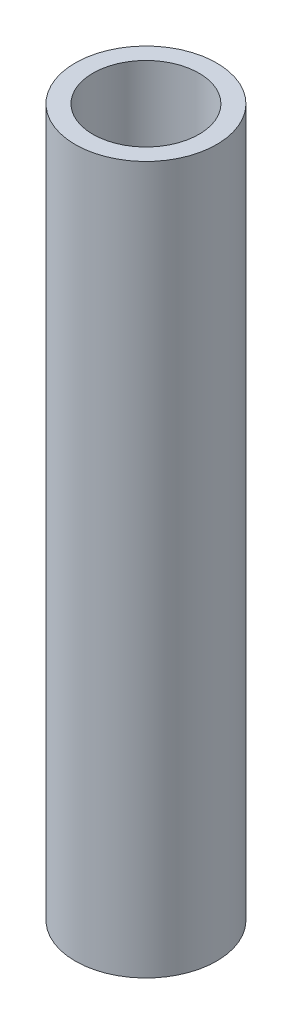
ISO-10303-21;
HEADER;
FILE_DESCRIPTION(('STEP AP214'),'2;1');
FILE_NAME('part.step','',(''),(''),'','','');
FILE_SCHEMA(('AUTOMOTIVE_DESIGN { 1 0 10303 214 1 1 1 1 }'));
ENDSEC;
DATA;
#1=APPLICATION_CONTEXT('core data for automotive mechanical design processes');
#2=APPLICATION_PROTOCOL_DEFINITION('international standard','automotive_design',2000,#1);
#3=PRODUCT_CONTEXT('',#1,'mechanical');
#4=PRODUCT('Part','Part','',(#3));
#5=PRODUCT_RELATED_PRODUCT_CATEGORY('part','',(#4));
#6=PRODUCT_DEFINITION_FORMATION('','',#4);
#7=PRODUCT_DEFINITION_CONTEXT('part definition',#1,'design');
#8=PRODUCT_DEFINITION('design','',#6,#7);
#9=PRODUCT_DEFINITION_SHAPE('','',#8);
#10=(LENGTH_UNIT() NAMED_UNIT(*) SI_UNIT(.MILLI.,.METRE.));
#11=(NAMED_UNIT(*) PLANE_ANGLE_UNIT() SI_UNIT($,.RADIAN.));
#12=(NAMED_UNIT(*) SI_UNIT($,.STERADIAN.) SOLID_ANGLE_UNIT());
#13=UNCERTAINTY_MEASURE_WITH_UNIT(LENGTH_MEASURE(1.E-05),#10,'distance_accuracy_value','');
#14=(GEOMETRIC_REPRESENTATION_CONTEXT(3) GLOBAL_UNCERTAINTY_ASSIGNED_CONTEXT((#13)) GLOBAL_UNIT_ASSIGNED_CONTEXT((#10,
#11,#12)) REPRESENTATION_CONTEXT('',''));
#15=CARTESIAN_POINT('',(0.,0.,0.));
#16=DIRECTION('',(0.,0.,1.));
#17=DIRECTION('',(1.,0.,0.));
#18=AXIS2_PLACEMENT_3D('',#15,#16,#17);
#19=CARTESIAN_POINT('',(0.,20.,0.));
#20=DIRECTION('',(0.,-1.,0.));
#21=DIRECTION('',(0.,0.,-1.));
#22=AXIS2_PLACEMENT_3D('',#19,#20,#21);
#23=CYLINDRICAL_SURFACE('',#22,2.);
#24=CARTESIAN_POINT('',(0.,20.,0.));
#25=DIRECTION('',(0.,1.,0.));
#26=DIRECTION('',(0.,0.,1.));
#27=AXIS2_PLACEMENT_3D('',#24,#25,#26);
#28=CIRCLE('',#27,2.);
#29=CARTESIAN_POINT('',(0.,20.,2.));
#30=VERTEX_POINT('',#29);
#31=EDGE_CURVE('E10',#30,#30,#28,.T.);
#32=ORIENTED_EDGE('',*,*,#31,.F.);
#33=EDGE_LOOP('',(#32));
#34=FACE_BOUND('',#33,.T.);
#35=CARTESIAN_POINT('',(0.,0.,0.));
#36=DIRECTION('',(0.,1.,0.));
#37=DIRECTION('',(0.,0.,1.));
#38=AXIS2_PLACEMENT_3D('',#35,#36,#37);
#39=CIRCLE('',#38,2.);
#40=CARTESIAN_POINT('',(0.,0.,2.));
#41=VERTEX_POINT('',#40);
#42=EDGE_CURVE('E40',#41,#41,#39,.T.);
#43=ORIENTED_EDGE('',*,*,#42,.T.);
#44=EDGE_LOOP('',(#43));
#45=FACE_BOUND('',#44,.T.);
#46=ADVANCED_FACE('F37',(#34,#45),#23,.T.);
#47=CARTESIAN_POINT('',(0.,20.,0.));
#48=DIRECTION('',(0.,1.,0.));
#49=DIRECTION('',(0.,0.,1.));
#50=AXIS2_PLACEMENT_3D('',#47,#48,#49);
#51=PLANE('',#50);
#52=CARTESIAN_POINT('',(0.,20.,0.));
#53=DIRECTION('',(0.,1.,0.));
#54=DIRECTION('',(0.,0.,1.));
#55=AXIS2_PLACEMENT_3D('',#52,#53,#54);
#56=CIRCLE('',#55,1.5);
#57=CARTESIAN_POINT('',(0.,20.,1.5));
#58=VERTEX_POINT('',#57);
#59=EDGE_CURVE('E51',#58,#58,#56,.T.);
#60=ORIENTED_EDGE('',*,*,#59,.F.);
#61=EDGE_LOOP('',(#60));
#62=FACE_BOUND('',#61,.T.);
#63=ORIENTED_EDGE('',*,*,#31,.T.);
#64=EDGE_LOOP('',(#63));
#65=FACE_BOUND('',#64,.T.);
#66=ADVANCED_FACE('F68',(#62,#65),#51,.T.);
#67=CARTESIAN_POINT('',(0.,0.,0.));
#68=DIRECTION('',(0.,1.,0.));
#69=DIRECTION('',(0.,0.,1.));
#70=AXIS2_PLACEMENT_3D('',#67,#68,#69);
#71=PLANE('',#70);
#72=ORIENTED_EDGE('',*,*,#42,.F.);
#73=EDGE_LOOP('',(#72));
#74=FACE_BOUND('',#73,.T.);
#75=ADVANCED_FACE('F64',(#74),#71,.F.);
#76=CARTESIAN_POINT('',(0.,17.,0.));
#77=DIRECTION('',(0.,1.,0.));
#78=DIRECTION('',(0.,0.,1.));
#79=AXIS2_PLACEMENT_3D('',#76,#77,#78);
#80=CYLINDRICAL_SURFACE('',#79,1.5);
#81=CARTESIAN_POINT('',(0.,17.,0.));
#82=DIRECTION('',(0.,1.,0.));
#83=DIRECTION('',(0.,0.,1.));
#84=AXIS2_PLACEMENT_3D('',#81,#82,#83);
#85=CIRCLE('',#84,1.5);
#86=CARTESIAN_POINT('',(0.,17.,1.5));
#87=VERTEX_POINT('',#86);
#88=EDGE_CURVE('E49',#87,#87,#85,.T.);
#89=ORIENTED_EDGE('',*,*,#88,.F.);
#90=EDGE_LOOP('',(#89));
#91=FACE_BOUND('',#90,.T.);
#92=ORIENTED_EDGE('',*,*,#59,.T.);
#93=EDGE_LOOP('',(#92));
#94=FACE_BOUND('',#93,.T.);
#95=ADVANCED_FACE('F61',(#91,#94),#80,.F.);
#96=CARTESIAN_POINT('',(0.,17.,0.));
#97=DIRECTION('',(0.,1.,0.));
#98=DIRECTION('',(0.,0.,1.));
#99=AXIS2_PLACEMENT_3D('',#96,#97,#98);
#100=PLANE('',#99);
#101=ORIENTED_EDGE('',*,*,#88,.T.);
#102=EDGE_LOOP('',(#101));
#103=FACE_BOUND('',#102,.T.);
#104=ADVANCED_FACE('F59',(#103),#100,.T.);
#105=CLOSED_SHELL('',(#46,#66,#75,#95,#104));
#106=MANIFOLD_SOLID_BREP('B2',#105);
#107=ADVANCED_BREP_SHAPE_REPRESENTATION('',(#18,#106),#14);
#108=SHAPE_DEFINITION_REPRESENTATION(#9,#107);
ENDSEC;
END-ISO-10303-21;
